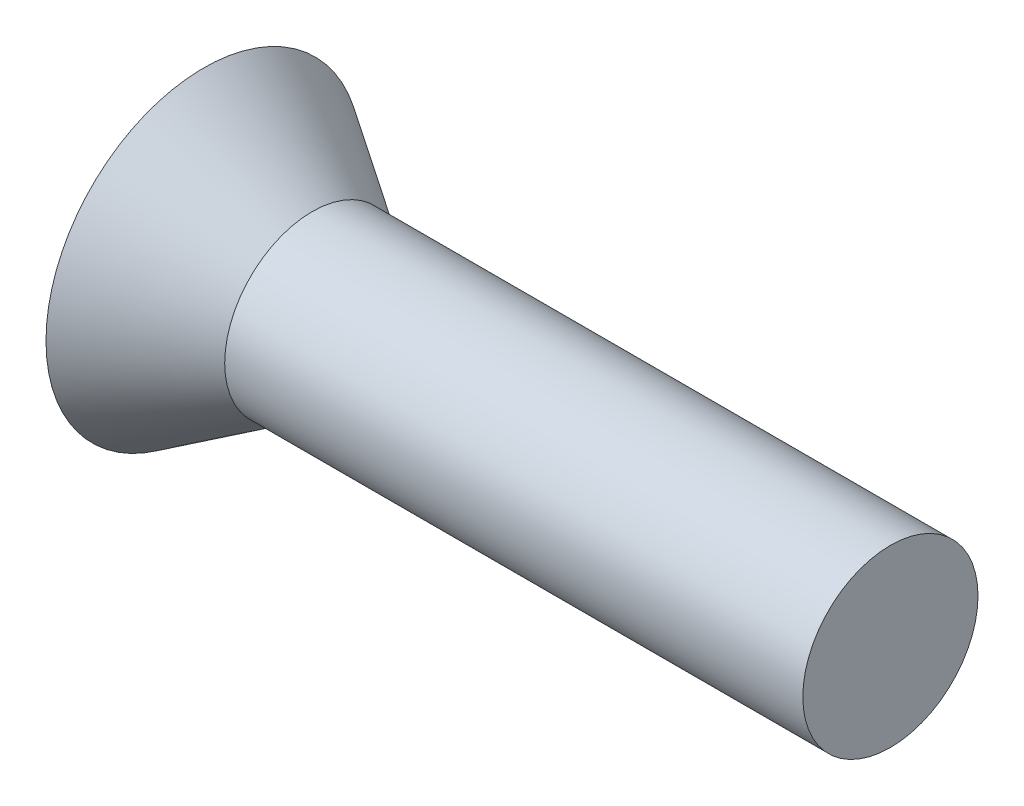
ISO-10303-21;
HEADER;
FILE_DESCRIPTION(('STEP AP214'),'2;1');
FILE_NAME('part.step','',(''),(''),'','','');
FILE_SCHEMA(('AUTOMOTIVE_DESIGN { 1 0 10303 214 1 1 1 1 }'));
ENDSEC;
DATA;
#1=APPLICATION_CONTEXT('core data for automotive mechanical design processes');
#2=APPLICATION_PROTOCOL_DEFINITION('international standard','automotive_design',2000,#1);
#3=PRODUCT_CONTEXT('',#1,'mechanical');
#4=PRODUCT('Part','Part','',(#3));
#5=PRODUCT_RELATED_PRODUCT_CATEGORY('part','',(#4));
#6=PRODUCT_DEFINITION_FORMATION('','',#4);
#7=PRODUCT_DEFINITION_CONTEXT('part definition',#1,'design');
#8=PRODUCT_DEFINITION('design','',#6,#7);
#9=PRODUCT_DEFINITION_SHAPE('','',#8);
#10=(LENGTH_UNIT() NAMED_UNIT(*) SI_UNIT(.MILLI.,.METRE.));
#11=(NAMED_UNIT(*) PLANE_ANGLE_UNIT() SI_UNIT($,.RADIAN.));
#12=(NAMED_UNIT(*) SI_UNIT($,.STERADIAN.) SOLID_ANGLE_UNIT());
#13=UNCERTAINTY_MEASURE_WITH_UNIT(LENGTH_MEASURE(1.E-05),#10,'distance_accuracy_value','');
#14=(GEOMETRIC_REPRESENTATION_CONTEXT(3) GLOBAL_UNCERTAINTY_ASSIGNED_CONTEXT((#13)) GLOBAL_UNIT_ASSIGNED_CONTEXT((#10,
#11,#12)) REPRESENTATION_CONTEXT('',''));
#15=CARTESIAN_POINT('',(0.,0.,0.));
#16=DIRECTION('',(0.,0.,1.));
#17=DIRECTION('',(1.,0.,0.));
#18=AXIS2_PLACEMENT_3D('',#15,#16,#17);
#19=CARTESIAN_POINT('',(-19.6,0.,0.));
#20=DIRECTION('',(1.,0.,0.));
#21=DIRECTION('',(0.,0.,-1.));
#22=AXIS2_PLACEMENT_3D('',#19,#20,#21);
#23=PLANE('',#22);
#24=DIRECTION('',(0.,0.,1.));
#25=VECTOR('',#24,1.);
#26=CARTESIAN_POINT('',(-19.6,0.5,0.));
#27=LINE('',#26,#25);
#28=CARTESIAN_POINT('',(-19.6,0.5,-2.25));
#29=VERTEX_POINT('',#28);
#30=CARTESIAN_POINT('',(-19.6,0.5,-0.5));
#31=VERTEX_POINT('',#30);
#32=EDGE_CURVE('E159',#29,#31,#27,.T.);
#33=ORIENTED_EDGE('',*,*,#32,.T.);
#34=DIRECTION('',(0.,-1.,0.));
#35=VECTOR('',#34,1.);
#36=CARTESIAN_POINT('',(-19.6,0.,-0.5));
#37=LINE('',#36,#35);
#38=CARTESIAN_POINT('',(-19.6,2.25,-0.5));
#39=VERTEX_POINT('',#38);
#40=EDGE_CURVE('E47',#39,#31,#37,.T.);
#41=ORIENTED_EDGE('',*,*,#40,.F.);
#42=DIRECTION('',(0.,0.,1.));
#43=VECTOR('',#42,1.);
#44=CARTESIAN_POINT('',(-19.6,2.25,0.));
#45=LINE('',#44,#43);
#46=CARTESIAN_POINT('',(-19.6,2.25,0.5));
#47=VERTEX_POINT('',#46);
#48=EDGE_CURVE('E186',#39,#47,#45,.T.);
#49=ORIENTED_EDGE('',*,*,#48,.T.);
#50=DIRECTION('',(0.,-1.,0.));
#51=VECTOR('',#50,1.);
#52=CARTESIAN_POINT('',(-19.6,0.,0.5));
#53=LINE('',#52,#51);
#54=CARTESIAN_POINT('',(-19.6,0.5,0.5));
#55=VERTEX_POINT('',#54);
#56=EDGE_CURVE('E184',#47,#55,#53,.T.);
#57=ORIENTED_EDGE('',*,*,#56,.T.);
#58=DIRECTION('',(0.,0.,1.));
#59=VECTOR('',#58,1.);
#60=CARTESIAN_POINT('',(-19.6,0.5,0.));
#61=LINE('',#60,#59);
#62=CARTESIAN_POINT('',(-19.6,0.5,2.25));
#63=VERTEX_POINT('',#62);
#64=EDGE_CURVE('E142',#55,#63,#61,.T.);
#65=ORIENTED_EDGE('',*,*,#64,.T.);
#66=DIRECTION('',(0.,-1.,0.));
#67=VECTOR('',#66,1.);
#68=CARTESIAN_POINT('',(-19.6,0.,2.25));
#69=LINE('',#68,#67);
#70=CARTESIAN_POINT('',(-19.6,-0.5,2.25));
#71=VERTEX_POINT('',#70);
#72=EDGE_CURVE('E180',#63,#71,#69,.T.);
#73=ORIENTED_EDGE('',*,*,#72,.T.);
#74=DIRECTION('',(0.,0.,1.));
#75=VECTOR('',#74,1.);
#76=CARTESIAN_POINT('',(-19.6,-0.5,0.));
#77=LINE('',#76,#75);
#78=CARTESIAN_POINT('',(-19.6,-0.5,0.5));
#79=VERTEX_POINT('',#78);
#80=EDGE_CURVE('E177',#79,#71,#77,.T.);
#81=ORIENTED_EDGE('',*,*,#80,.F.);
#82=DIRECTION('',(0.,-1.,0.));
#83=VECTOR('',#82,1.);
#84=CARTESIAN_POINT('',(-19.6,0.,0.5));
#85=LINE('',#84,#83);
#86=CARTESIAN_POINT('',(-19.6,-2.25,0.5));
#87=VERTEX_POINT('',#86);
#88=EDGE_CURVE('E174',#79,#87,#85,.T.);
#89=ORIENTED_EDGE('',*,*,#88,.T.);
#90=DIRECTION('',(0.,0.,1.));
#91=VECTOR('',#90,1.);
#92=CARTESIAN_POINT('',(-19.6,-2.25,0.));
#93=LINE('',#92,#91);
#94=CARTESIAN_POINT('',(-19.6,-2.25,-0.5));
#95=VERTEX_POINT('',#94);
#96=EDGE_CURVE('E171',#95,#87,#93,.T.);
#97=ORIENTED_EDGE('',*,*,#96,.F.);
#98=DIRECTION('',(0.,-1.,0.));
#99=VECTOR('',#98,1.);
#100=CARTESIAN_POINT('',(-19.6,0.,-0.5));
#101=LINE('',#100,#99);
#102=CARTESIAN_POINT('',(-19.6,-0.5,-0.5));
#103=VERTEX_POINT('',#102);
#104=EDGE_CURVE('E168',#103,#95,#101,.T.);
#105=ORIENTED_EDGE('',*,*,#104,.F.);
#106=DIRECTION('',(0.,0.,1.));
#107=VECTOR('',#106,1.);
#108=CARTESIAN_POINT('',(-19.6,-0.5,0.));
#109=LINE('',#108,#107);
#110=CARTESIAN_POINT('',(-19.6,-0.5,-2.25));
#111=VERTEX_POINT('',#110);
#112=EDGE_CURVE('E165',#111,#103,#109,.T.);
#113=ORIENTED_EDGE('',*,*,#112,.F.);
#114=DIRECTION('',(0.,-1.,0.));
#115=VECTOR('',#114,1.);
#116=CARTESIAN_POINT('',(-19.6,0.,-2.25));
#117=LINE('',#116,#115);
#118=EDGE_CURVE('E162',#29,#111,#117,.T.);
#119=ORIENTED_EDGE('',*,*,#118,.F.);
#120=EDGE_LOOP('',(#33,#41,#49,#57,#65,#73,#81,#89,#97,#105,#113,#119));
#121=FACE_BOUND('',#120,.T.);
#122=CARTESIAN_POINT('',(-19.6,0.,0.));
#123=DIRECTION('',(-1.,0.,0.));
#124=DIRECTION('',(0.,0.,1.));
#125=AXIS2_PLACEMENT_3D('',#122,#123,#124);
#126=CIRCLE('',#125,4.5);
#127=CARTESIAN_POINT('',(-19.6,0.,4.5));
#128=VERTEX_POINT('',#127);
#129=EDGE_CURVE('E11',#128,#128,#126,.T.);
#130=ORIENTED_EDGE('',*,*,#129,.T.);
#131=EDGE_LOOP('',(#130));
#132=FACE_BOUND('',#131,.T.);
#133=ADVANCED_FACE('F33',(#121,#132),#23,.F.);
#134=CARTESIAN_POINT('',(-16.5,0.,0.));
#135=DIRECTION('',(-1.,0.,0.));
#136=DIRECTION('',(0.,0.,1.));
#137=AXIS2_PLACEMENT_3D('',#134,#135,#136);
#138=CONICAL_SURFACE('',#137,2.5,0.572966142888705);
#139=ORIENTED_EDGE('',*,*,#129,.F.);
#140=EDGE_LOOP('',(#139));
#141=FACE_BOUND('',#140,.T.);
#142=CARTESIAN_POINT('',(-16.5,0.,0.));
#143=DIRECTION('',(-1.,0.,0.));
#144=DIRECTION('',(0.,0.,1.));
#145=AXIS2_PLACEMENT_3D('',#142,#143,#144);
#146=CIRCLE('',#145,2.5);
#147=CARTESIAN_POINT('',(-16.5,0.,2.5));
#148=VERTEX_POINT('',#147);
#149=EDGE_CURVE('E40',#148,#148,#146,.T.);
#150=ORIENTED_EDGE('',*,*,#149,.T.);
#151=EDGE_LOOP('',(#150));
#152=FACE_BOUND('',#151,.T.);
#153=ADVANCED_FACE('F213',(#141,#152),#138,.T.);
#154=CARTESIAN_POINT('',(-51.6305712850344,0.,0.));
#155=DIRECTION('',(-1.,0.,0.));
#156=DIRECTION('',(0.,0.,1.));
#157=AXIS2_PLACEMENT_3D('',#154,#155,#156);
#158=CYLINDRICAL_SURFACE('',#157,2.5);
#159=ORIENTED_EDGE('',*,*,#149,.F.);
#160=EDGE_LOOP('',(#159));
#161=FACE_BOUND('',#160,.T.);
#162=CARTESIAN_POINT('',(0.,0.,0.));
#163=DIRECTION('',(-1.,0.,0.));
#164=DIRECTION('',(0.,0.,1.));
#165=AXIS2_PLACEMENT_3D('',#162,#163,#164);
#166=CIRCLE('',#165,2.5);
#167=CARTESIAN_POINT('',(0.,0.,2.5));
#168=VERTEX_POINT('',#167);
#169=EDGE_CURVE('E191',#168,#168,#166,.T.);
#170=ORIENTED_EDGE('',*,*,#169,.T.);
#171=EDGE_LOOP('',(#170));
#172=FACE_BOUND('',#171,.T.);
#173=ADVANCED_FACE('F215',(#161,#172),#158,.T.);
#174=CARTESIAN_POINT('',(0.,2.5,0.));
#175=DIRECTION('',(-1.,0.,0.));
#176=DIRECTION('',(0.,0.,1.));
#177=AXIS2_PLACEMENT_3D('',#174,#175,#176);
#178=PLANE('',#177);
#179=ORIENTED_EDGE('',*,*,#169,.F.);
#180=EDGE_LOOP('',(#179));
#181=FACE_BOUND('',#180,.T.);
#182=ADVANCED_FACE('F218',(#181),#178,.F.);
#183=CARTESIAN_POINT('',(-17.6,0.,-0.5));
#184=DIRECTION('',(0.,0.,-1.));
#185=DIRECTION('',(0.,1.,0.));
#186=AXIS2_PLACEMENT_3D('',#183,#184,#185);
#187=PLANE('',#186);
#188=ORIENTED_EDGE('',*,*,#40,.T.);
#189=DIRECTION('',(-1.,0.,0.));
#190=VECTOR('',#189,1.);
#191=CARTESIAN_POINT('',(-17.6,0.5,-0.5));
#192=LINE('',#191,#190);
#193=CARTESIAN_POINT('',(-17.6,0.5,-0.5));
#194=VERTEX_POINT('',#193);
#195=EDGE_CURVE('E157',#194,#31,#192,.T.);
#196=ORIENTED_EDGE('',*,*,#195,.F.);
#197=DIRECTION('',(0.,-1.,0.));
#198=VECTOR('',#197,1.);
#199=CARTESIAN_POINT('',(-17.6,0.,-0.5));
#200=LINE('',#199,#198);
#201=CARTESIAN_POINT('',(-17.6,2.25,-0.5));
#202=VERTEX_POINT('',#201);
#203=EDGE_CURVE('E189',#202,#194,#200,.T.);
#204=ORIENTED_EDGE('',*,*,#203,.F.);
#205=DIRECTION('',(-1.,0.,0.));
#206=VECTOR('',#205,1.);
#207=CARTESIAN_POINT('',(-17.6,2.25,-0.5));
#208=LINE('',#207,#206);
#209=EDGE_CURVE('E55',#202,#39,#208,.T.);
#210=ORIENTED_EDGE('',*,*,#209,.T.);
#211=EDGE_LOOP('',(#188,#196,#204,#210));
#212=FACE_BOUND('',#211,.T.);
#213=ADVANCED_FACE('F223',(#212),#187,.F.);
#214=CARTESIAN_POINT('',(-17.6,2.25,0.));
#215=DIRECTION('',(0.,-1.,0.));
#216=DIRECTION('',(0.,0.,-1.));
#217=AXIS2_PLACEMENT_3D('',#214,#215,#216);
#218=PLANE('',#217);
#219=ORIENTED_EDGE('',*,*,#48,.F.);
#220=ORIENTED_EDGE('',*,*,#209,.F.);
#221=DIRECTION('',(0.,0.,1.));
#222=VECTOR('',#221,1.);
#223=CARTESIAN_POINT('',(-17.6,2.25,0.));
#224=LINE('',#223,#222);
#225=CARTESIAN_POINT('',(-17.6,2.25,0.5));
#226=VERTEX_POINT('',#225);
#227=EDGE_CURVE('E135',#202,#226,#224,.T.);
#228=ORIENTED_EDGE('',*,*,#227,.T.);
#229=DIRECTION('',(-1.,0.,0.));
#230=VECTOR('',#229,1.);
#231=CARTESIAN_POINT('',(-17.6,2.25,0.5));
#232=LINE('',#231,#230);
#233=EDGE_CURVE('E132',#226,#47,#232,.T.);
#234=ORIENTED_EDGE('',*,*,#233,.T.);
#235=EDGE_LOOP('',(#219,#220,#228,#234));
#236=FACE_BOUND('',#235,.T.);
#237=ADVANCED_FACE('F228',(#236),#218,.T.);
#238=CARTESIAN_POINT('',(-17.6,0.,0.5));
#239=DIRECTION('',(0.,0.,-1.));
#240=DIRECTION('',(0.,1.,0.));
#241=AXIS2_PLACEMENT_3D('',#238,#239,#240);
#242=PLANE('',#241);
#243=ORIENTED_EDGE('',*,*,#56,.F.);
#244=ORIENTED_EDGE('',*,*,#233,.F.);
#245=DIRECTION('',(0.,-1.,0.));
#246=VECTOR('',#245,1.);
#247=CARTESIAN_POINT('',(-17.6,0.,0.5));
#248=LINE('',#247,#246);
#249=CARTESIAN_POINT('',(-17.6,0.5,0.5));
#250=VERTEX_POINT('',#249);
#251=EDGE_CURVE('E126',#226,#250,#248,.T.);
#252=ORIENTED_EDGE('',*,*,#251,.T.);
#253=DIRECTION('',(-1.,0.,0.));
#254=VECTOR('',#253,1.);
#255=CARTESIAN_POINT('',(-17.6,0.5,0.5));
#256=LINE('',#255,#254);
#257=EDGE_CURVE('E130',#250,#55,#256,.T.);
#258=ORIENTED_EDGE('',*,*,#257,.T.);
#259=EDGE_LOOP('',(#243,#244,#252,#258));
#260=FACE_BOUND('',#259,.T.);
#261=ADVANCED_FACE('F129',(#260),#242,.T.);
#262=CARTESIAN_POINT('',(-17.6,0.5,0.));
#263=DIRECTION('',(0.,-1.,0.));
#264=DIRECTION('',(0.,0.,-1.));
#265=AXIS2_PLACEMENT_3D('',#262,#263,#264);
#266=PLANE('',#265);
#267=ORIENTED_EDGE('',*,*,#64,.F.);
#268=ORIENTED_EDGE('',*,*,#257,.F.);
#269=DIRECTION('',(0.,0.,1.));
#270=VECTOR('',#269,1.);
#271=CARTESIAN_POINT('',(-17.6,0.5,0.));
#272=LINE('',#271,#270);
#273=CARTESIAN_POINT('',(-17.6,0.5,2.25));
#274=VERTEX_POINT('',#273);
#275=EDGE_CURVE('E136',#250,#274,#272,.T.);
#276=ORIENTED_EDGE('',*,*,#275,.T.);
#277=DIRECTION('',(-1.,0.,0.));
#278=VECTOR('',#277,1.);
#279=CARTESIAN_POINT('',(-17.6,0.5,2.25));
#280=LINE('',#279,#278);
#281=EDGE_CURVE('E144',#274,#63,#280,.T.);
#282=ORIENTED_EDGE('',*,*,#281,.T.);
#283=EDGE_LOOP('',(#267,#268,#276,#282));
#284=FACE_BOUND('',#283,.T.);
#285=ADVANCED_FACE('F139',(#284),#266,.T.);
#286=CARTESIAN_POINT('',(-17.6,0.,2.25));
#287=DIRECTION('',(0.,0.,-1.));
#288=DIRECTION('',(-1.,0.,0.));
#289=AXIS2_PLACEMENT_3D('',#286,#287,#288);
#290=PLANE('',#289);
#291=ORIENTED_EDGE('',*,*,#72,.F.);
#292=ORIENTED_EDGE('',*,*,#281,.F.);
#293=DIRECTION('',(0.,-1.,0.));
#294=VECTOR('',#293,1.);
#295=CARTESIAN_POINT('',(-17.6,0.,2.25));
#296=LINE('',#295,#294);
#297=CARTESIAN_POINT('',(-17.6,-0.5,2.25));
#298=VERTEX_POINT('',#297);
#299=EDGE_CURVE('E150',#274,#298,#296,.T.);
#300=ORIENTED_EDGE('',*,*,#299,.T.);
#301=DIRECTION('',(-1.,0.,0.));
#302=VECTOR('',#301,1.);
#303=CARTESIAN_POINT('',(-17.6,-0.5,2.25));
#304=LINE('',#303,#302);
#305=EDGE_CURVE('E194',#298,#71,#304,.T.);
#306=ORIENTED_EDGE('',*,*,#305,.T.);
#307=EDGE_LOOP('',(#291,#292,#300,#306));
#308=FACE_BOUND('',#307,.T.);
#309=ADVANCED_FACE('F268',(#308),#290,.T.);
#310=CARTESIAN_POINT('',(-17.6,-0.5,0.));
#311=DIRECTION('',(0.,-1.,0.));
#312=DIRECTION('',(0.,0.,-1.));
#313=AXIS2_PLACEMENT_3D('',#310,#311,#312);
#314=PLANE('',#313);
#315=ORIENTED_EDGE('',*,*,#80,.T.);
#316=ORIENTED_EDGE('',*,*,#305,.F.);
#317=DIRECTION('',(0.,0.,1.));
#318=VECTOR('',#317,1.);
#319=CARTESIAN_POINT('',(-17.6,-0.5,0.));
#320=LINE('',#319,#318);
#321=CARTESIAN_POINT('',(-17.6,-0.5,0.5));
#322=VERTEX_POINT('',#321);
#323=EDGE_CURVE('E152',#322,#298,#320,.T.);
#324=ORIENTED_EDGE('',*,*,#323,.F.);
#325=DIRECTION('',(-1.,0.,0.));
#326=VECTOR('',#325,1.);
#327=CARTESIAN_POINT('',(-17.6,-0.5,0.5));
#328=LINE('',#327,#326);
#329=EDGE_CURVE('E196',#322,#79,#328,.T.);
#330=ORIENTED_EDGE('',*,*,#329,.T.);
#331=EDGE_LOOP('',(#315,#316,#324,#330));
#332=FACE_BOUND('',#331,.T.);
#333=ADVANCED_FACE('F263',(#332),#314,.F.);
#334=CARTESIAN_POINT('',(-17.6,0.,0.5));
#335=DIRECTION('',(0.,0.,-1.));
#336=DIRECTION('',(0.,1.,0.));
#337=AXIS2_PLACEMENT_3D('',#334,#335,#336);
#338=PLANE('',#337);
#339=ORIENTED_EDGE('',*,*,#88,.F.);
#340=ORIENTED_EDGE('',*,*,#329,.F.);
#341=DIRECTION('',(0.,-1.,0.));
#342=VECTOR('',#341,1.);
#343=CARTESIAN_POINT('',(-17.6,0.,0.5));
#344=LINE('',#343,#342);
#345=CARTESIAN_POINT('',(-17.6,-2.25,0.5));
#346=VERTEX_POINT('',#345);
#347=EDGE_CURVE('E258',#322,#346,#344,.T.);
#348=ORIENTED_EDGE('',*,*,#347,.T.);
#349=DIRECTION('',(-1.,0.,0.));
#350=VECTOR('',#349,1.);
#351=CARTESIAN_POINT('',(-17.6,-2.25,0.5));
#352=LINE('',#351,#350);
#353=EDGE_CURVE('E198',#346,#87,#352,.T.);
#354=ORIENTED_EDGE('',*,*,#353,.T.);
#355=EDGE_LOOP('',(#339,#340,#348,#354));
#356=FACE_BOUND('',#355,.T.);
#357=ADVANCED_FACE('F283',(#356),#338,.T.);
#358=CARTESIAN_POINT('',(-17.6,-2.25,0.));
#359=DIRECTION('',(0.,-1.,0.));
#360=DIRECTION('',(0.,0.,-1.));
#361=AXIS2_PLACEMENT_3D('',#358,#359,#360);
#362=PLANE('',#361);
#363=ORIENTED_EDGE('',*,*,#96,.T.);
#364=ORIENTED_EDGE('',*,*,#353,.F.);
#365=DIRECTION('',(0.,0.,1.));
#366=VECTOR('',#365,1.);
#367=CARTESIAN_POINT('',(-17.6,-2.25,0.));
#368=LINE('',#367,#366);
#369=CARTESIAN_POINT('',(-17.6,-2.25,-0.5));
#370=VERTEX_POINT('',#369);
#371=EDGE_CURVE('E255',#370,#346,#368,.T.);
#372=ORIENTED_EDGE('',*,*,#371,.F.);
#373=DIRECTION('',(-1.,0.,0.));
#374=VECTOR('',#373,1.);
#375=CARTESIAN_POINT('',(-17.6,-2.25,-0.5));
#376=LINE('',#375,#374);
#377=EDGE_CURVE('E200',#370,#95,#376,.T.);
#378=ORIENTED_EDGE('',*,*,#377,.T.);
#379=EDGE_LOOP('',(#363,#364,#372,#378));
#380=FACE_BOUND('',#379,.T.);
#381=ADVANCED_FACE('F286',(#380),#362,.F.);
#382=CARTESIAN_POINT('',(-17.6,0.,-0.5));
#383=DIRECTION('',(0.,0.,-1.));
#384=DIRECTION('',(0.,1.,0.));
#385=AXIS2_PLACEMENT_3D('',#382,#383,#384);
#386=PLANE('',#385);
#387=ORIENTED_EDGE('',*,*,#104,.T.);
#388=ORIENTED_EDGE('',*,*,#377,.F.);
#389=DIRECTION('',(0.,-1.,0.));
#390=VECTOR('',#389,1.);
#391=CARTESIAN_POINT('',(-17.6,0.,-0.5));
#392=LINE('',#391,#390);
#393=CARTESIAN_POINT('',(-17.6,-0.5,-0.5));
#394=VERTEX_POINT('',#393);
#395=EDGE_CURVE('E252',#394,#370,#392,.T.);
#396=ORIENTED_EDGE('',*,*,#395,.F.);
#397=DIRECTION('',(-1.,0.,0.));
#398=VECTOR('',#397,1.);
#399=CARTESIAN_POINT('',(-17.6,-0.5,-0.5));
#400=LINE('',#399,#398);
#401=EDGE_CURVE('E202',#394,#103,#400,.T.);
#402=ORIENTED_EDGE('',*,*,#401,.T.);
#403=EDGE_LOOP('',(#387,#388,#396,#402));
#404=FACE_BOUND('',#403,.T.);
#405=ADVANCED_FACE('F290',(#404),#386,.F.);
#406=CARTESIAN_POINT('',(-17.6,-0.5,0.));
#407=DIRECTION('',(0.,-1.,0.));
#408=DIRECTION('',(0.,0.,-1.));
#409=AXIS2_PLACEMENT_3D('',#406,#407,#408);
#410=PLANE('',#409);
#411=ORIENTED_EDGE('',*,*,#112,.T.);
#412=ORIENTED_EDGE('',*,*,#401,.F.);
#413=DIRECTION('',(0.,0.,1.));
#414=VECTOR('',#413,1.);
#415=CARTESIAN_POINT('',(-17.6,-0.5,0.));
#416=LINE('',#415,#414);
#417=CARTESIAN_POINT('',(-17.6,-0.5,-2.25));
#418=VERTEX_POINT('',#417);
#419=EDGE_CURVE('E249',#418,#394,#416,.T.);
#420=ORIENTED_EDGE('',*,*,#419,.F.);
#421=DIRECTION('',(-1.,0.,0.));
#422=VECTOR('',#421,1.);
#423=CARTESIAN_POINT('',(-17.6,-0.5,-2.25));
#424=LINE('',#423,#422);
#425=EDGE_CURVE('E204',#418,#111,#424,.T.);
#426=ORIENTED_EDGE('',*,*,#425,.T.);
#427=EDGE_LOOP('',(#411,#412,#420,#426));
#428=FACE_BOUND('',#427,.T.);
#429=ADVANCED_FACE('F294',(#428),#410,.F.);
#430=CARTESIAN_POINT('',(-17.6,0.,-2.25));
#431=DIRECTION('',(0.,0.,-1.));
#432=DIRECTION('',(-1.,0.,0.));
#433=AXIS2_PLACEMENT_3D('',#430,#431,#432);
#434=PLANE('',#433);
#435=ORIENTED_EDGE('',*,*,#118,.T.);
#436=ORIENTED_EDGE('',*,*,#425,.F.);
#437=DIRECTION('',(0.,-1.,0.));
#438=VECTOR('',#437,1.);
#439=CARTESIAN_POINT('',(-17.6,0.,-2.25));
#440=LINE('',#439,#438);
#441=CARTESIAN_POINT('',(-17.6,0.5,-2.25));
#442=VERTEX_POINT('',#441);
#443=EDGE_CURVE('E245',#442,#418,#440,.T.);
#444=ORIENTED_EDGE('',*,*,#443,.F.);
#445=DIRECTION('',(-1.,0.,0.));
#446=VECTOR('',#445,1.);
#447=CARTESIAN_POINT('',(-17.6,0.5,-2.25));
#448=LINE('',#447,#446);
#449=EDGE_CURVE('E206',#442,#29,#448,.T.);
#450=ORIENTED_EDGE('',*,*,#449,.T.);
#451=EDGE_LOOP('',(#435,#436,#444,#450));
#452=FACE_BOUND('',#451,.T.);
#453=ADVANCED_FACE('F298',(#452),#434,.F.);
#454=CARTESIAN_POINT('',(-17.6,0.5,0.));
#455=DIRECTION('',(0.,-1.,0.));
#456=DIRECTION('',(0.,0.,-1.));
#457=AXIS2_PLACEMENT_3D('',#454,#455,#456);
#458=PLANE('',#457);
#459=ORIENTED_EDGE('',*,*,#32,.F.);
#460=ORIENTED_EDGE('',*,*,#449,.F.);
#461=DIRECTION('',(0.,0.,1.));
#462=VECTOR('',#461,1.);
#463=CARTESIAN_POINT('',(-17.6,0.5,0.));
#464=LINE('',#463,#462);
#465=EDGE_CURVE('E99',#442,#194,#464,.T.);
#466=ORIENTED_EDGE('',*,*,#465,.T.);
#467=ORIENTED_EDGE('',*,*,#195,.T.);
#468=EDGE_LOOP('',(#459,#460,#466,#467));
#469=FACE_BOUND('',#468,.T.);
#470=ADVANCED_FACE('F241',(#469),#458,.T.);
#471=CARTESIAN_POINT('',(-17.6,0.,0.));
#472=DIRECTION('',(-1.,0.,0.));
#473=DIRECTION('',(0.,0.,1.));
#474=AXIS2_PLACEMENT_3D('',#471,#472,#473);
#475=PLANE('',#474);
#476=ORIENTED_EDGE('',*,*,#203,.T.);
#477=ORIENTED_EDGE('',*,*,#465,.F.);
#478=ORIENTED_EDGE('',*,*,#443,.T.);
#479=ORIENTED_EDGE('',*,*,#419,.T.);
#480=ORIENTED_EDGE('',*,*,#395,.T.);
#481=ORIENTED_EDGE('',*,*,#371,.T.);
#482=ORIENTED_EDGE('',*,*,#347,.F.);
#483=ORIENTED_EDGE('',*,*,#323,.T.);
#484=ORIENTED_EDGE('',*,*,#299,.F.);
#485=ORIENTED_EDGE('',*,*,#275,.F.);
#486=ORIENTED_EDGE('',*,*,#251,.F.);
#487=ORIENTED_EDGE('',*,*,#227,.F.);
#488=EDGE_LOOP('',(#476,#477,#478,#479,#480,#481,#482,#483,#484,#485,#486,#487));
#489=FACE_BOUND('',#488,.T.);
#490=ADVANCED_FACE('F148',(#489),#475,.T.);
#491=CLOSED_SHELL('',(#133,#153,#173,#182,#213,#237,#261,#285,#309,#333,#357,#381,#405,#429,
#453,#470,#490));
#492=MANIFOLD_SOLID_BREP('B2',#491);
#493=ADVANCED_BREP_SHAPE_REPRESENTATION('',(#18,#492),#14);
#494=SHAPE_DEFINITION_REPRESENTATION(#9,#493);
ENDSEC;
END-ISO-10303-21;
